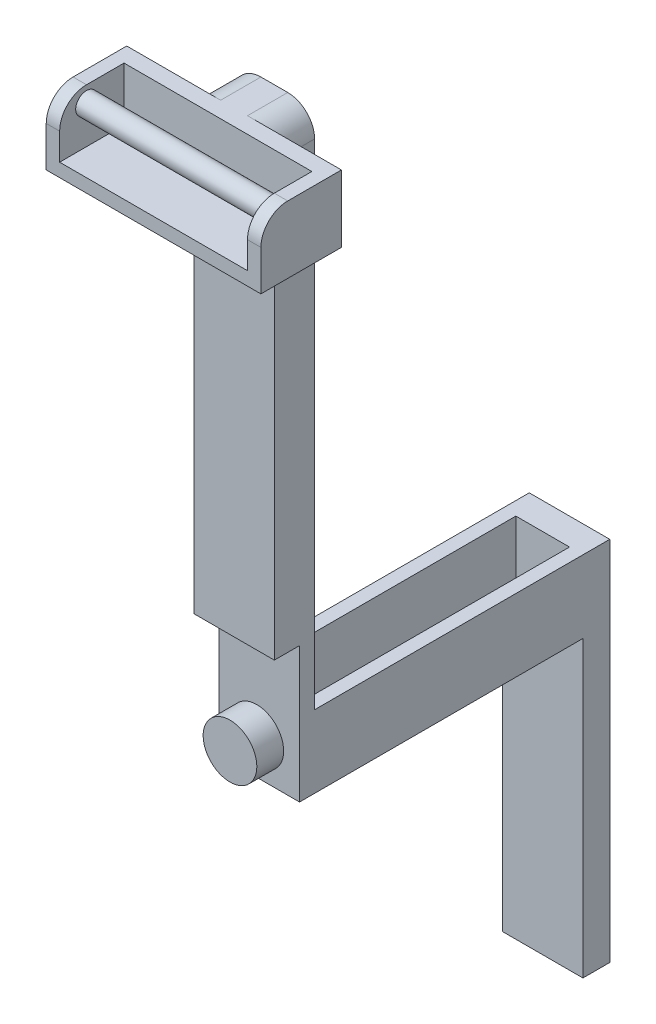
ISO-10303-21;
HEADER;
FILE_DESCRIPTION(('STEP AP214'),'2;1');
FILE_NAME('part.step','',(''),(''),'','','');
FILE_SCHEMA(('AUTOMOTIVE_DESIGN { 1 0 10303 214 1 1 1 1 }'));
ENDSEC;
DATA;
#1=APPLICATION_CONTEXT('core data for automotive mechanical design processes');
#2=APPLICATION_PROTOCOL_DEFINITION('international standard','automotive_design',2000,#1);
#3=PRODUCT_CONTEXT('',#1,'mechanical');
#4=PRODUCT('Part','Part','',(#3));
#5=PRODUCT_RELATED_PRODUCT_CATEGORY('part','',(#4));
#6=PRODUCT_DEFINITION_FORMATION('','',#4);
#7=PRODUCT_DEFINITION_CONTEXT('part definition',#1,'design');
#8=PRODUCT_DEFINITION('design','',#6,#7);
#9=PRODUCT_DEFINITION_SHAPE('','',#8);
#10=(LENGTH_UNIT() NAMED_UNIT(*) SI_UNIT(.MILLI.,.METRE.));
#11=(NAMED_UNIT(*) PLANE_ANGLE_UNIT() SI_UNIT($,.RADIAN.));
#12=(NAMED_UNIT(*) SI_UNIT($,.STERADIAN.) SOLID_ANGLE_UNIT());
#13=UNCERTAINTY_MEASURE_WITH_UNIT(LENGTH_MEASURE(1.E-05),#10,'distance_accuracy_value','');
#14=(GEOMETRIC_REPRESENTATION_CONTEXT(3) GLOBAL_UNCERTAINTY_ASSIGNED_CONTEXT((#13)) GLOBAL_UNIT_ASSIGNED_CONTEXT((#10,
#11,#12)) REPRESENTATION_CONTEXT('',''));
#15=CARTESIAN_POINT('',(0.,0.,0.));
#16=DIRECTION('',(0.,0.,1.));
#17=DIRECTION('',(1.,0.,0.));
#18=AXIS2_PLACEMENT_3D('',#15,#16,#17);
#19=CARTESIAN_POINT('',(-33.5,249.065015771818,5.60294788594664));
#20=DIRECTION('',(0.,0.,-1.));
#21=DIRECTION('',(0.,1.,0.));
#22=AXIS2_PLACEMENT_3D('',#19,#20,#21);
#23=PLANE('',#22);
#24=DIRECTION('',(0.,-1.,0.));
#25=VECTOR('',#24,1.);
#26=CARTESIAN_POINT('',(0.,-197.77568742367,5.6029478859466));
#27=LINE('',#26,#25);
#28=CARTESIAN_POINT('',(0.,249.065015771818,5.60294788594664));
#29=VERTEX_POINT('',#28);
#30=CARTESIAN_POINT('',(0.,198.565015771818,5.60294788594664));
#31=VERTEX_POINT('',#30);
#32=EDGE_CURVE('E224',#29,#31,#27,.T.);
#33=ORIENTED_EDGE('',*,*,#32,.T.);
#34=DIRECTION('',(1.,0.,0.));
#35=VECTOR('',#34,1.);
#36=CARTESIAN_POINT('',(-33.5,198.565015771818,5.60294788594664));
#37=LINE('',#36,#35);
#38=CARTESIAN_POINT('',(30.,198.565015771818,5.60294788594664));
#39=VERTEX_POINT('',#38);
#40=EDGE_CURVE('E400',#31,#39,#37,.T.);
#41=ORIENTED_EDGE('',*,*,#40,.T.);
#42=DIRECTION('',(0.,-1.,0.));
#43=VECTOR('',#42,1.);
#44=CARTESIAN_POINT('',(30.,-197.77568742367,5.6029478859466));
#45=LINE('',#44,#43);
#46=CARTESIAN_POINT('',(30.,249.065015771818,5.60294788594664));
#47=VERTEX_POINT('',#46);
#48=EDGE_CURVE('E39',#47,#39,#45,.T.);
#49=ORIENTED_EDGE('',*,*,#48,.F.);
#50=DIRECTION('',(1.,0.,0.));
#51=VECTOR('',#50,1.);
#52=CARTESIAN_POINT('',(-33.5,249.065015771818,5.60294788594664));
#53=LINE('',#52,#51);
#54=EDGE_CURVE('E216',#29,#47,#53,.T.);
#55=ORIENTED_EDGE('',*,*,#54,.F.);
#56=EDGE_LOOP('',(#33,#41,#49,#55));
#57=FACE_BOUND('',#56,.T.);
#58=CARTESIAN_POINT('',(14.0801246712385,212.060594595528,5.60294788594664));
#59=DIRECTION('',(0.,0.,-1.));
#60=DIRECTION('',(0.,1.,0.));
#61=AXIS2_PLACEMENT_3D('',#58,#59,#60);
#62=CIRCLE('',#61,10.);
#63=CARTESIAN_POINT('',(14.0801246712385,222.060594595528,5.60294788594664));
#64=VERTEX_POINT('',#63);
#65=EDGE_CURVE('E11',#64,#64,#62,.F.);
#66=ORIENTED_EDGE('',*,*,#65,.F.);
#67=EDGE_LOOP('',(#66));
#68=FACE_BOUND('',#67,.T.);
#69=ADVANCED_FACE('F31',(#57,#68),#23,.F.);
#70=CARTESIAN_POINT('',(15.,-197.77568742367,0.));
#71=DIRECTION('',(0.,0.,1.));
#72=DIRECTION('',(1.,0.,0.));
#73=AXIS2_PLACEMENT_3D('',#70,#71,#72);
#74=PLANE('',#73);
#75=DIRECTION('',(1.,0.,0.));
#76=VECTOR('',#75,1.);
#77=CARTESIAN_POINT('',(25.,225.565015771818,0.));
#78=LINE('',#77,#76);
#79=CARTESIAN_POINT('',(25.,225.565015771818,0.));
#80=VERTEX_POINT('',#79);
#81=CARTESIAN_POINT('',(30.,225.565015771818,0.));
#82=VERTEX_POINT('',#81);
#83=EDGE_CURVE('E54',#80,#82,#78,.T.);
#84=ORIENTED_EDGE('',*,*,#83,.F.);
#85=DIRECTION('',(0.,1.,0.));
#86=VECTOR('',#85,1.);
#87=CARTESIAN_POINT('',(25.,203.565015771818,0.));
#88=LINE('',#87,#86);
#89=CARTESIAN_POINT('',(25.,203.565015771818,0.));
#90=VERTEX_POINT('',#89);
#91=EDGE_CURVE('E271',#90,#80,#88,.T.);
#92=ORIENTED_EDGE('',*,*,#91,.F.);
#93=DIRECTION('',(1.,0.,0.));
#94=VECTOR('',#93,1.);
#95=CARTESIAN_POINT('',(5.,203.565015771818,0.));
#96=LINE('',#95,#94);
#97=CARTESIAN_POINT('',(5.,203.565015771818,0.));
#98=VERTEX_POINT('',#97);
#99=EDGE_CURVE('E491',#98,#90,#96,.T.);
#100=ORIENTED_EDGE('',*,*,#99,.F.);
#101=DIRECTION('',(0.,-1.,0.));
#102=VECTOR('',#101,1.);
#103=CARTESIAN_POINT('',(5.,225.565015771818,0.));
#104=LINE('',#103,#102);
#105=CARTESIAN_POINT('',(5.,225.565015771818,0.));
#106=VERTEX_POINT('',#105);
#107=EDGE_CURVE('E257',#106,#98,#104,.T.);
#108=ORIENTED_EDGE('',*,*,#107,.F.);
#109=DIRECTION('',(1.,0.,0.));
#110=VECTOR('',#109,1.);
#111=CARTESIAN_POINT('',(0.,225.565015771818,0.));
#112=LINE('',#111,#110);
#113=CARTESIAN_POINT('',(0.,225.565015771818,0.));
#114=VERTEX_POINT('',#113);
#115=EDGE_CURVE('E254',#114,#106,#112,.T.);
#116=ORIENTED_EDGE('',*,*,#115,.F.);
#117=DIRECTION('',(0.,1.,0.));
#118=VECTOR('',#117,1.);
#119=CARTESIAN_POINT('',(0.,-197.77568742367,0.));
#120=LINE('',#119,#118);
#121=CARTESIAN_POINT('',(0.,409.765015771818,0.));
#122=VERTEX_POINT('',#121);
#123=EDGE_CURVE('E248',#114,#122,#120,.T.);
#124=ORIENTED_EDGE('',*,*,#123,.T.);
#125=CARTESIAN_POINT('',(10.,409.765015771818,0.));
#126=DIRECTION('',(0.,0.,1.));
#127=DIRECTION('',(1.,0.,0.));
#128=AXIS2_PLACEMENT_3D('',#125,#126,#127);
#129=CIRCLE('',#128,10.);
#130=CARTESIAN_POINT('',(10.,419.765015771818,0.));
#131=VERTEX_POINT('',#130);
#132=EDGE_CURVE('E374',#122,#131,#129,.F.);
#133=ORIENTED_EDGE('',*,*,#132,.T.);
#134=DIRECTION('',(-1.,0.,0.));
#135=VECTOR('',#134,1.);
#136=CARTESIAN_POINT('',(15.,419.765015771818,0.));
#137=LINE('',#136,#135);
#138=CARTESIAN_POINT('',(20.,419.765015771818,0.));
#139=VERTEX_POINT('',#138);
#140=EDGE_CURVE('E236',#139,#131,#137,.T.);
#141=ORIENTED_EDGE('',*,*,#140,.F.);
#142=CARTESIAN_POINT('',(20.,409.765015771818,0.));
#143=DIRECTION('',(0.,0.,1.));
#144=DIRECTION('',(1.,0.,0.));
#145=AXIS2_PLACEMENT_3D('',#142,#143,#144);
#146=CIRCLE('',#145,10.);
#147=CARTESIAN_POINT('',(30.,409.765015771818,0.));
#148=VERTEX_POINT('',#147);
#149=EDGE_CURVE('E242',#139,#148,#146,.F.);
#150=ORIENTED_EDGE('',*,*,#149,.T.);
#151=DIRECTION('',(0.,1.,0.));
#152=VECTOR('',#151,1.);
#153=CARTESIAN_POINT('',(30.,-197.77568742367,0.));
#154=LINE('',#153,#152);
#155=EDGE_CURVE('E251',#82,#148,#154,.T.);
#156=ORIENTED_EDGE('',*,*,#155,.F.);
#157=EDGE_LOOP('',(#84,#92,#100,#108,#116,#124,#133,#141,#150,#156));
#158=FACE_BOUND('',#157,.T.);
#159=ADVANCED_FACE('F388',(#158),#74,.F.);
#160=CARTESIAN_POINT('',(-19.9999999999998,419.765015771818,21.));
#161=DIRECTION('',(-1.,0.,0.));
#162=DIRECTION('',(0.,0.,1.));
#163=AXIS2_PLACEMENT_3D('',#160,#161,#162);
#164=PLANE('',#163);
#165=DIRECTION('',(0.,0.,1.));
#166=VECTOR('',#165,1.);
#167=CARTESIAN_POINT('',(-19.9999999999998,419.765015771818,21.));
#168=LINE('',#167,#166);
#169=CARTESIAN_POINT('',(-19.9999999999998,419.765015771818,21.));
#170=VERTEX_POINT('',#169);
#171=CARTESIAN_POINT('',(-19.9999999999998,419.765015771818,35.));
#172=VERTEX_POINT('',#171);
#173=EDGE_CURVE('E307',#170,#172,#168,.T.);
#174=ORIENTED_EDGE('',*,*,#173,.T.);
#175=CARTESIAN_POINT('',(-19.9999999999998,409.765015771818,35.));
#176=DIRECTION('',(-1.,0.,0.));
#177=DIRECTION('',(0.,0.,1.));
#178=AXIS2_PLACEMENT_3D('',#175,#176,#177);
#179=CIRCLE('',#178,10.);
#180=CARTESIAN_POINT('',(-19.9999999999998,409.765015771818,45.));
#181=VERTEX_POINT('',#180);
#182=EDGE_CURVE('E537',#172,#181,#179,.F.);
#183=ORIENTED_EDGE('',*,*,#182,.T.);
#184=DIRECTION('',(0.,-1.,0.));
#185=VECTOR('',#184,1.);
#186=CARTESIAN_POINT('',(-19.9999999999998,419.765015771818,45.));
#187=LINE('',#186,#185);
#188=CARTESIAN_POINT('',(-19.9999999999998,399.765015771818,45.));
#189=VERTEX_POINT('',#188);
#190=EDGE_CURVE('E299',#181,#189,#187,.T.);
#191=ORIENTED_EDGE('',*,*,#190,.T.);
#192=DIRECTION('',(0.,0.,1.));
#193=VECTOR('',#192,1.);
#194=CARTESIAN_POINT('',(-19.9999999999998,399.765015771818,21.));
#195=LINE('',#194,#193);
#196=CARTESIAN_POINT('',(-19.9999999999998,399.765015771818,21.));
#197=VERTEX_POINT('',#196);
#198=EDGE_CURVE('E298',#197,#189,#195,.T.);
#199=ORIENTED_EDGE('',*,*,#198,.F.);
#200=DIRECTION('',(0.,-1.,0.));
#201=VECTOR('',#200,1.);
#202=CARTESIAN_POINT('',(-19.9999999999998,419.765015771818,21.));
#203=LINE('',#202,#201);
#204=EDGE_CURVE('E285',#170,#197,#203,.T.);
#205=ORIENTED_EDGE('',*,*,#204,.F.);
#206=EDGE_LOOP('',(#174,#183,#191,#199,#205));
#207=FACE_BOUND('',#206,.T.);
#208=CARTESIAN_POINT('',(-19.9999999999818,413.847695374528,35.));
#209=DIRECTION('',(-1.,0.,0.));
#210=DIRECTION('',(0.,0.,1.));
#211=AXIS2_PLACEMENT_3D('',#208,#209,#210);
#212=CIRCLE('',#211,4.02917800820291);
#213=CARTESIAN_POINT('',(-19.9999999999818,413.847695374528,30.9708219917971));
#214=VERTEX_POINT('',#213);
#215=EDGE_CURVE('E550',#214,#214,#212,.F.);
#216=ORIENTED_EDGE('',*,*,#215,.F.);
#217=EDGE_LOOP('',(#216));
#218=FACE_BOUND('',#217,.T.);
#219=ADVANCED_FACE('F556',(#207,#218),#164,.F.);
#220=CARTESIAN_POINT('',(50.0000000000002,419.765015771818,21.));
#221=DIRECTION('',(1.,0.,0.));
#222=DIRECTION('',(0.,0.,-1.));
#223=AXIS2_PLACEMENT_3D('',#220,#221,#222);
#224=PLANE('',#223);
#225=DIRECTION('',(0.,1.,0.));
#226=VECTOR('',#225,1.);
#227=CARTESIAN_POINT('',(50.0000000000002,419.765015771818,45.));
#228=LINE('',#227,#226);
#229=CARTESIAN_POINT('',(50.0000000000002,399.765015771818,45.));
#230=VERTEX_POINT('',#229);
#231=CARTESIAN_POINT('',(50.0000000000002,409.765015771818,45.));
#232=VERTEX_POINT('',#231);
#233=EDGE_CURVE('E289',#230,#232,#228,.T.);
#234=ORIENTED_EDGE('',*,*,#233,.T.);
#235=CARTESIAN_POINT('',(50.0000000000002,409.765015771818,35.));
#236=DIRECTION('',(1.,0.,0.));
#237=DIRECTION('',(0.,0.,-1.));
#238=AXIS2_PLACEMENT_3D('',#235,#236,#237);
#239=CIRCLE('',#238,10.);
#240=CARTESIAN_POINT('',(50.0000000000002,419.765015771818,35.));
#241=VERTEX_POINT('',#240);
#242=EDGE_CURVE('E540',#232,#241,#239,.F.);
#243=ORIENTED_EDGE('',*,*,#242,.T.);
#244=DIRECTION('',(0.,0.,1.));
#245=VECTOR('',#244,1.);
#246=CARTESIAN_POINT('',(50.0000000000002,419.765015771818,21.));
#247=LINE('',#246,#245);
#248=CARTESIAN_POINT('',(50.0000000000002,419.765015771818,21.));
#249=VERTEX_POINT('',#248);
#250=EDGE_CURVE('E311',#249,#241,#247,.T.);
#251=ORIENTED_EDGE('',*,*,#250,.F.);
#252=DIRECTION('',(0.,1.,0.));
#253=VECTOR('',#252,1.);
#254=CARTESIAN_POINT('',(50.0000000000002,419.765015771818,21.));
#255=LINE('',#254,#253);
#256=CARTESIAN_POINT('',(50.0000000000002,399.765015771818,21.));
#257=VERTEX_POINT('',#256);
#258=EDGE_CURVE('E292',#257,#249,#255,.T.);
#259=ORIENTED_EDGE('',*,*,#258,.F.);
#260=DIRECTION('',(0.,0.,1.));
#261=VECTOR('',#260,1.);
#262=CARTESIAN_POINT('',(50.0000000000002,399.765015771818,21.));
#263=LINE('',#262,#261);
#264=EDGE_CURVE('E314',#257,#230,#263,.T.);
#265=ORIENTED_EDGE('',*,*,#264,.T.);
#266=EDGE_LOOP('',(#234,#243,#251,#259,#265));
#267=FACE_BOUND('',#266,.T.);
#268=CARTESIAN_POINT('',(50.0000000000114,413.847695374528,35.));
#269=DIRECTION('',(1.,0.,0.));
#270=DIRECTION('',(0.,0.,-1.));
#271=AXIS2_PLACEMENT_3D('',#268,#269,#270);
#272=CIRCLE('',#271,4.02917800820291);
#273=CARTESIAN_POINT('',(49.9999999999545,413.847695374528,30.9708219917971));
#274=VERTEX_POINT('',#273);
#275=EDGE_CURVE('E548',#274,#274,#272,.F.);
#276=ORIENTED_EDGE('',*,*,#275,.F.);
#277=EDGE_LOOP('',(#276));
#278=FACE_BOUND('',#277,.T.);
#279=ADVANCED_FACE('F558',(#267,#278),#224,.F.);
#280=CARTESIAN_POINT('',(15.,198.565015771818,15.));
#281=DIRECTION('',(0.,-1.,0.));
#282=DIRECTION('',(0.,0.,-1.));
#283=AXIS2_PLACEMENT_3D('',#280,#281,#282);
#284=PLANE('',#283);
#285=ORIENTED_EDGE('',*,*,#40,.F.);
#286=DIRECTION('',(0.,0.,-1.));
#287=VECTOR('',#286,1.);
#288=CARTESIAN_POINT('',(0.,198.565015771818,45.));
#289=LINE('',#288,#287);
#290=CARTESIAN_POINT('',(0.,198.565015771818,-100.));
#291=VERTEX_POINT('',#290);
#292=EDGE_CURVE('E264',#31,#291,#289,.T.);
#293=ORIENTED_EDGE('',*,*,#292,.T.);
#294=DIRECTION('',(-1.,0.,0.));
#295=VECTOR('',#294,1.);
#296=CARTESIAN_POINT('',(30.,198.565015771818,-100.));
#297=LINE('',#296,#295);
#298=CARTESIAN_POINT('',(30.,198.565015771818,-100.));
#299=VERTEX_POINT('',#298);
#300=EDGE_CURVE('E270',#299,#291,#297,.T.);
#301=ORIENTED_EDGE('',*,*,#300,.F.);
#302=DIRECTION('',(0.,0.,-1.));
#303=VECTOR('',#302,1.);
#304=CARTESIAN_POINT('',(30.,198.565015771818,45.));
#305=LINE('',#304,#303);
#306=EDGE_CURVE('E302',#39,#299,#305,.T.);
#307=ORIENTED_EDGE('',*,*,#306,.F.);
#308=EDGE_LOOP('',(#285,#293,#301,#307));
#309=FACE_BOUND('',#308,.T.);
#310=ADVANCED_FACE('F564',(#309),#284,.T.);
#311=CARTESIAN_POINT('',(0.,-197.77568742367,15.));
#312=DIRECTION('',(-1.,0.,0.));
#313=DIRECTION('',(0.,0.,1.));
#314=AXIS2_PLACEMENT_3D('',#311,#312,#313);
#315=PLANE('',#314);
#316=DIRECTION('',(0.,0.,-1.));
#317=VECTOR('',#316,1.);
#318=CARTESIAN_POINT('',(0.,249.065015771818,15.));
#319=LINE('',#318,#317);
#320=CARTESIAN_POINT('',(0.,249.065015771818,15.));
#321=VERTEX_POINT('',#320);
#322=EDGE_CURVE('E211',#321,#29,#319,.T.);
#323=ORIENTED_EDGE('',*,*,#322,.F.);
#324=DIRECTION('',(0.,1.,0.));
#325=VECTOR('',#324,1.);
#326=CARTESIAN_POINT('',(0.,-197.77568742367,15.));
#327=LINE('',#326,#325);
#328=CARTESIAN_POINT('',(0.,394.765015771818,15.));
#329=VERTEX_POINT('',#328);
#330=EDGE_CURVE('E221',#321,#329,#327,.T.);
#331=ORIENTED_EDGE('',*,*,#330,.T.);
#332=CARTESIAN_POINT('',(0.,409.765015771818,15.));
#333=VERTEX_POINT('',#332);
#334=EDGE_CURVE('E231',#329,#333,#327,.T.);
#335=ORIENTED_EDGE('',*,*,#334,.T.);
#336=DIRECTION('',(0.,0.,-1.));
#337=VECTOR('',#336,1.);
#338=CARTESIAN_POINT('',(0.,409.765015771818,0.));
#339=LINE('',#338,#337);
#340=EDGE_CURVE('E361',#333,#122,#339,.T.);
#341=ORIENTED_EDGE('',*,*,#340,.T.);
#342=ORIENTED_EDGE('',*,*,#123,.F.);
#343=DIRECTION('',(0.,0.,1.));
#344=VECTOR('',#343,1.);
#345=CARTESIAN_POINT('',(0.,225.565015771818,-100.));
#346=LINE('',#345,#344);
#347=CARTESIAN_POINT('',(0.,225.565015771818,-110.));
#348=VERTEX_POINT('',#347);
#349=EDGE_CURVE('E261',#348,#114,#346,.T.);
#350=ORIENTED_EDGE('',*,*,#349,.F.);
#351=DIRECTION('',(0.,1.,0.));
#352=VECTOR('',#351,1.);
#353=CARTESIAN_POINT('',(0.,225.565015771818,-110.));
#354=LINE('',#353,#352);
#355=CARTESIAN_POINT('',(0.,88.9838340423188,-110.));
#356=VERTEX_POINT('',#355);
#357=EDGE_CURVE('E411',#356,#348,#354,.T.);
#358=ORIENTED_EDGE('',*,*,#357,.F.);
#359=DIRECTION('',(0.,0.,1.));
#360=VECTOR('',#359,1.);
#361=CARTESIAN_POINT('',(0.,88.9838340423188,-110.));
#362=LINE('',#361,#360);
#363=CARTESIAN_POINT('',(0.,88.9838340423188,-100.));
#364=VERTEX_POINT('',#363);
#365=EDGE_CURVE('E417',#356,#364,#362,.T.);
#366=ORIENTED_EDGE('',*,*,#365,.T.);
#367=DIRECTION('',(0.,1.,0.));
#368=VECTOR('',#367,1.);
#369=CARTESIAN_POINT('',(0.,225.565015771818,-100.));
#370=LINE('',#369,#368);
#371=EDGE_CURVE('E429',#364,#291,#370,.T.);
#372=ORIENTED_EDGE('',*,*,#371,.T.);
#373=ORIENTED_EDGE('',*,*,#292,.F.);
#374=ORIENTED_EDGE('',*,*,#32,.F.);
#375=EDGE_LOOP('',(#323,#331,#335,#341,#342,#350,#358,#366,#372,#373,#374));
#376=FACE_BOUND('',#375,.T.);
#377=ADVANCED_FACE('F220',(#376),#315,.T.);
#378=CARTESIAN_POINT('',(30.,-197.77568742367,15.));
#379=DIRECTION('',(-1.,0.,0.));
#380=DIRECTION('',(0.,0.,1.));
#381=AXIS2_PLACEMENT_3D('',#378,#379,#380);
#382=PLANE('',#381);
#383=DIRECTION('',(0.,1.,0.));
#384=VECTOR('',#383,1.);
#385=CARTESIAN_POINT('',(30.,-197.77568742367,15.));
#386=LINE('',#385,#384);
#387=CARTESIAN_POINT('',(30.,249.065015771818,15.));
#388=VERTEX_POINT('',#387);
#389=CARTESIAN_POINT('',(30.,394.765015771818,15.));
#390=VERTEX_POINT('',#389);
#391=EDGE_CURVE('E234',#388,#390,#386,.T.);
#392=ORIENTED_EDGE('',*,*,#391,.F.);
#393=DIRECTION('',(0.,0.,-1.));
#394=VECTOR('',#393,1.);
#395=CARTESIAN_POINT('',(30.,249.065015771818,15.));
#396=LINE('',#395,#394);
#397=EDGE_CURVE('E46',#388,#47,#396,.T.);
#398=ORIENTED_EDGE('',*,*,#397,.T.);
#399=ORIENTED_EDGE('',*,*,#48,.T.);
#400=ORIENTED_EDGE('',*,*,#306,.T.);
#401=DIRECTION('',(0.,-1.,0.));
#402=VECTOR('',#401,1.);
#403=CARTESIAN_POINT('',(30.,225.565015771818,-100.));
#404=LINE('',#403,#402);
#405=CARTESIAN_POINT('',(30.,88.9838340423188,-100.));
#406=VERTEX_POINT('',#405);
#407=EDGE_CURVE('E404',#299,#406,#404,.T.);
#408=ORIENTED_EDGE('',*,*,#407,.T.);
#409=DIRECTION('',(0.,0.,1.));
#410=VECTOR('',#409,1.);
#411=CARTESIAN_POINT('',(30.,88.9838340423188,-110.));
#412=LINE('',#411,#410);
#413=CARTESIAN_POINT('',(30.,88.9838340423188,-110.));
#414=VERTEX_POINT('',#413);
#415=EDGE_CURVE('E258',#414,#406,#412,.T.);
#416=ORIENTED_EDGE('',*,*,#415,.F.);
#417=DIRECTION('',(0.,-1.,0.));
#418=VECTOR('',#417,1.);
#419=CARTESIAN_POINT('',(30.,225.565015771818,-110.));
#420=LINE('',#419,#418);
#421=CARTESIAN_POINT('',(30.,225.565015771818,-110.));
#422=VERTEX_POINT('',#421);
#423=EDGE_CURVE('E405',#422,#414,#420,.T.);
#424=ORIENTED_EDGE('',*,*,#423,.F.);
#425=DIRECTION('',(0.,0.,1.));
#426=VECTOR('',#425,1.);
#427=CARTESIAN_POINT('',(30.,225.565015771818,-100.));
#428=LINE('',#427,#426);
#429=EDGE_CURVE('E272',#422,#82,#428,.T.);
#430=ORIENTED_EDGE('',*,*,#429,.T.);
#431=ORIENTED_EDGE('',*,*,#155,.T.);
#432=DIRECTION('',(0.,0.,-1.));
#433=VECTOR('',#432,1.);
#434=CARTESIAN_POINT('',(30.,409.765015771818,15.));
#435=LINE('',#434,#433);
#436=CARTESIAN_POINT('',(30.,409.765015771818,15.));
#437=VERTEX_POINT('',#436);
#438=EDGE_CURVE('E348',#148,#437,#435,.F.);
#439=ORIENTED_EDGE('',*,*,#438,.T.);
#440=EDGE_CURVE('E230',#390,#437,#386,.T.);
#441=ORIENTED_EDGE('',*,*,#440,.F.);
#442=EDGE_LOOP('',(#392,#398,#399,#400,#408,#416,#424,#430,#431,#439,#441));
#443=FACE_BOUND('',#442,.T.);
#444=ADVANCED_FACE('F386',(#443),#382,.F.);
#445=CARTESIAN_POINT('',(15.,419.765015771818,15.));
#446=DIRECTION('',(0.,-1.,0.));
#447=DIRECTION('',(0.,0.,-1.));
#448=AXIS2_PLACEMENT_3D('',#445,#446,#447);
#449=PLANE('',#448);
#450=DIRECTION('',(0.,0.,-1.));
#451=VECTOR('',#450,1.);
#452=CARTESIAN_POINT('',(-24.9999999999998,419.765015771818,45.));
#453=LINE('',#452,#451);
#454=CARTESIAN_POINT('',(-24.9999999999998,419.765015771818,35.));
#455=VERTEX_POINT('',#454);
#456=CARTESIAN_POINT('',(-24.9999999999998,419.765015771818,15.));
#457=VERTEX_POINT('',#456);
#458=EDGE_CURVE('E337',#455,#457,#453,.T.);
#459=ORIENTED_EDGE('',*,*,#458,.F.);
#460=DIRECTION('',(-1.,0.,0.));
#461=VECTOR('',#460,1.);
#462=CARTESIAN_POINT('',(15.,419.765015771818,35.));
#463=LINE('',#462,#461);
#464=EDGE_CURVE('E532',#455,#172,#463,.F.);
#465=ORIENTED_EDGE('',*,*,#464,.T.);
#466=ORIENTED_EDGE('',*,*,#173,.F.);
#467=DIRECTION('',(-1.,0.,0.));
#468=VECTOR('',#467,1.);
#469=CARTESIAN_POINT('',(-19.9999999999998,419.765015771818,21.));
#470=LINE('',#469,#468);
#471=EDGE_CURVE('E295',#249,#170,#470,.T.);
#472=ORIENTED_EDGE('',*,*,#471,.F.);
#473=ORIENTED_EDGE('',*,*,#250,.T.);
#474=DIRECTION('',(-1.,0.,0.));
#475=VECTOR('',#474,1.);
#476=CARTESIAN_POINT('',(15.,419.765015771818,35.));
#477=LINE('',#476,#475);
#478=CARTESIAN_POINT('',(55.0000000000002,419.765015771818,35.));
#479=VERTEX_POINT('',#478);
#480=EDGE_CURVE('E538',#241,#479,#477,.F.);
#481=ORIENTED_EDGE('',*,*,#480,.T.);
#482=DIRECTION('',(0.,0.,-1.));
#483=VECTOR('',#482,1.);
#484=CARTESIAN_POINT('',(55.0000000000002,419.765015771818,45.));
#485=LINE('',#484,#483);
#486=CARTESIAN_POINT('',(55.0000000000002,419.765015771818,15.));
#487=VERTEX_POINT('',#486);
#488=EDGE_CURVE('E252',#479,#487,#485,.T.);
#489=ORIENTED_EDGE('',*,*,#488,.T.);
#490=DIRECTION('',(-1.,0.,0.));
#491=VECTOR('',#490,1.);
#492=CARTESIAN_POINT('',(-24.9999999999998,419.765015771818,15.));
#493=LINE('',#492,#491);
#494=CARTESIAN_POINT('',(20.,419.765015771818,15.));
#495=VERTEX_POINT('',#494);
#496=EDGE_CURVE('E333',#487,#495,#493,.T.);
#497=ORIENTED_EDGE('',*,*,#496,.T.);
#498=DIRECTION('',(0.,0.,-1.));
#499=VECTOR('',#498,1.);
#500=CARTESIAN_POINT('',(20.,419.765015771818,15.));
#501=LINE('',#500,#499);
#502=EDGE_CURVE('E358',#495,#139,#501,.T.);
#503=ORIENTED_EDGE('',*,*,#502,.T.);
#504=ORIENTED_EDGE('',*,*,#140,.T.);
#505=DIRECTION('',(0.,0.,-1.));
#506=VECTOR('',#505,1.);
#507=CARTESIAN_POINT('',(10.,419.765015771818,15.));
#508=LINE('',#507,#506);
#509=CARTESIAN_POINT('',(10.,419.765015771818,15.));
#510=VERTEX_POINT('',#509);
#511=EDGE_CURVE('E352',#131,#510,#508,.F.);
#512=ORIENTED_EDGE('',*,*,#511,.T.);
#513=EDGE_CURVE('E238',#510,#457,#493,.T.);
#514=ORIENTED_EDGE('',*,*,#513,.T.);
#515=EDGE_LOOP('',(#459,#465,#466,#472,#473,#481,#489,#497,#503,#504,#512,#514));
#516=FACE_BOUND('',#515,.T.);
#517=ADVANCED_FACE('F505',(#516),#449,.F.);
#518=CARTESIAN_POINT('',(15.,-197.77568742367,15.));
#519=DIRECTION('',(0.,0.,1.));
#520=DIRECTION('',(1.,0.,0.));
#521=AXIS2_PLACEMENT_3D('',#518,#519,#520);
#522=PLANE('',#521);
#523=DIRECTION('',(1.,0.,0.));
#524=VECTOR('',#523,1.);
#525=CARTESIAN_POINT('',(-33.5,249.065015771818,15.));
#526=LINE('',#525,#524);
#527=EDGE_CURVE('E208',#321,#388,#526,.T.);
#528=ORIENTED_EDGE('',*,*,#527,.T.);
#529=ORIENTED_EDGE('',*,*,#391,.T.);
#530=DIRECTION('',(1.,0.,0.));
#531=VECTOR('',#530,1.);
#532=CARTESIAN_POINT('',(-24.9999999999998,394.765015771818,15.));
#533=LINE('',#532,#531);
#534=EDGE_CURVE('E228',#329,#390,#533,.T.);
#535=ORIENTED_EDGE('',*,*,#534,.F.);
#536=ORIENTED_EDGE('',*,*,#330,.F.);
#537=EDGE_LOOP('',(#528,#529,#535,#536));
#538=FACE_BOUND('',#537,.T.);
#539=ADVANCED_FACE('F226',(#538),#522,.T.);
#540=CARTESIAN_POINT('',(10.,409.765015771818,15.));
#541=DIRECTION('',(0.,0.,1.));
#542=DIRECTION('',(1.,0.,0.));
#543=AXIS2_PLACEMENT_3D('',#540,#541,#542);
#544=CYLINDRICAL_SURFACE('',#543,10.);
#545=CARTESIAN_POINT('',(10.,409.765015771818,15.));
#546=DIRECTION('',(0.,0.,1.));
#547=DIRECTION('',(1.,0.,0.));
#548=AXIS2_PLACEMENT_3D('',#545,#546,#547);
#549=CIRCLE('',#548,10.);
#550=EDGE_CURVE('E366',#510,#333,#549,.T.);
#551=ORIENTED_EDGE('',*,*,#550,.F.);
#552=ORIENTED_EDGE('',*,*,#511,.F.);
#553=ORIENTED_EDGE('',*,*,#132,.F.);
#554=ORIENTED_EDGE('',*,*,#340,.F.);
#555=EDGE_LOOP('',(#551,#552,#553,#554));
#556=FACE_BOUND('',#555,.T.);
#557=ADVANCED_FACE('F529',(#556),#544,.T.);
#558=CARTESIAN_POINT('',(20.,409.765015771818,15.));
#559=DIRECTION('',(0.,0.,-1.));
#560=DIRECTION('',(-1.,0.,0.));
#561=AXIS2_PLACEMENT_3D('',#558,#559,#560);
#562=CYLINDRICAL_SURFACE('',#561,10.);
#563=CARTESIAN_POINT('',(20.,409.765015771818,15.));
#564=DIRECTION('',(0.,0.,1.));
#565=DIRECTION('',(1.,0.,0.));
#566=AXIS2_PLACEMENT_3D('',#563,#564,#565);
#567=CIRCLE('',#566,10.);
#568=EDGE_CURVE('E369',#437,#495,#567,.T.);
#569=ORIENTED_EDGE('',*,*,#568,.F.);
#570=ORIENTED_EDGE('',*,*,#438,.F.);
#571=ORIENTED_EDGE('',*,*,#149,.F.);
#572=ORIENTED_EDGE('',*,*,#502,.F.);
#573=EDGE_LOOP('',(#569,#570,#571,#572));
#574=FACE_BOUND('',#573,.T.);
#575=ADVANCED_FACE('F390',(#574),#562,.T.);
#576=CARTESIAN_POINT('',(55.0000000000002,419.765015771818,15.));
#577=DIRECTION('',(0.,0.,-1.));
#578=DIRECTION('',(-1.,0.,0.));
#579=AXIS2_PLACEMENT_3D('',#576,#577,#578);
#580=PLANE('',#579);
#581=CARTESIAN_POINT('',(55.0000000000002,394.765015771818,15.));
#582=VERTEX_POINT('',#581);
#583=EDGE_CURVE('E344',#390,#582,#533,.T.);
#584=ORIENTED_EDGE('',*,*,#583,.F.);
#585=ORIENTED_EDGE('',*,*,#440,.T.);
#586=ORIENTED_EDGE('',*,*,#568,.T.);
#587=ORIENTED_EDGE('',*,*,#496,.F.);
#588=DIRECTION('',(0.,1.,0.));
#589=VECTOR('',#588,1.);
#590=CARTESIAN_POINT('',(55.0000000000002,394.765015771818,15.));
#591=LINE('',#590,#589);
#592=EDGE_CURVE('E310',#582,#487,#591,.T.);
#593=ORIENTED_EDGE('',*,*,#592,.F.);
#594=EDGE_LOOP('',(#584,#585,#586,#587,#593));
#595=FACE_BOUND('',#594,.T.);
#596=ADVANCED_FACE('F394',(#595),#580,.T.);
#597=CARTESIAN_POINT('',(55.0000000000002,394.765015771818,45.));
#598=DIRECTION('',(-1.,0.,0.));
#599=DIRECTION('',(0.,0.,1.));
#600=AXIS2_PLACEMENT_3D('',#597,#598,#599);
#601=PLANE('',#600);
#602=ORIENTED_EDGE('',*,*,#488,.F.);
#603=CARTESIAN_POINT('',(55.0000000000002,409.765015771818,35.));
#604=DIRECTION('',(-1.,0.,0.));
#605=DIRECTION('',(0.,0.,1.));
#606=AXIS2_PLACEMENT_3D('',#603,#604,#605);
#607=CIRCLE('',#606,10.);
#608=CARTESIAN_POINT('',(55.0000000000002,409.765015771818,45.));
#609=VERTEX_POINT('',#608);
#610=EDGE_CURVE('E546',#479,#609,#607,.F.);
#611=ORIENTED_EDGE('',*,*,#610,.T.);
#612=DIRECTION('',(0.,1.,0.));
#613=VECTOR('',#612,1.);
#614=CARTESIAN_POINT('',(55.0000000000002,394.765015771818,45.));
#615=LINE('',#614,#613);
#616=CARTESIAN_POINT('',(55.0000000000002,394.765015771818,45.));
#617=VERTEX_POINT('',#616);
#618=EDGE_CURVE('E318',#617,#609,#615,.T.);
#619=ORIENTED_EDGE('',*,*,#618,.F.);
#620=DIRECTION('',(0.,0.,-1.));
#621=VECTOR('',#620,1.);
#622=CARTESIAN_POINT('',(55.0000000000002,394.765015771818,45.));
#623=LINE('',#622,#621);
#624=EDGE_CURVE('E326',#617,#582,#623,.T.);
#625=ORIENTED_EDGE('',*,*,#624,.T.);
#626=ORIENTED_EDGE('',*,*,#592,.T.);
#627=EDGE_LOOP('',(#602,#611,#619,#625,#626));
#628=FACE_BOUND('',#627,.T.);
#629=ADVANCED_FACE('F508',(#628),#601,.F.);
#630=CARTESIAN_POINT('',(-24.9999999999998,394.765015771818,45.));
#631=DIRECTION('',(1.,0.,0.));
#632=DIRECTION('',(0.,0.,-1.));
#633=AXIS2_PLACEMENT_3D('',#630,#631,#632);
#634=PLANE('',#633);
#635=DIRECTION('',(0.,-1.,0.));
#636=VECTOR('',#635,1.);
#637=CARTESIAN_POINT('',(-24.9999999999998,394.765015771818,45.));
#638=LINE('',#637,#636);
#639=CARTESIAN_POINT('',(-24.9999999999998,409.765015771818,45.));
#640=VERTEX_POINT('',#639);
#641=CARTESIAN_POINT('',(-24.9999999999998,394.765015771818,45.));
#642=VERTEX_POINT('',#641);
#643=EDGE_CURVE('E321',#640,#642,#638,.T.);
#644=ORIENTED_EDGE('',*,*,#643,.F.);
#645=CARTESIAN_POINT('',(-24.9999999999998,409.765015771818,35.));
#646=DIRECTION('',(1.,0.,0.));
#647=DIRECTION('',(0.,0.,-1.));
#648=AXIS2_PLACEMENT_3D('',#645,#646,#647);
#649=CIRCLE('',#648,10.);
#650=EDGE_CURVE('E536',#640,#455,#649,.F.);
#651=ORIENTED_EDGE('',*,*,#650,.T.);
#652=ORIENTED_EDGE('',*,*,#458,.T.);
#653=DIRECTION('',(0.,-1.,0.));
#654=VECTOR('',#653,1.);
#655=CARTESIAN_POINT('',(-24.9999999999998,394.765015771818,15.));
#656=LINE('',#655,#654);
#657=CARTESIAN_POINT('',(-24.9999999999998,394.765015771818,15.));
#658=VERTEX_POINT('',#657);
#659=EDGE_CURVE('E330',#457,#658,#656,.T.);
#660=ORIENTED_EDGE('',*,*,#659,.T.);
#661=DIRECTION('',(0.,0.,-1.));
#662=VECTOR('',#661,1.);
#663=CARTESIAN_POINT('',(-24.9999999999998,394.765015771818,45.));
#664=LINE('',#663,#662);
#665=EDGE_CURVE('E339',#642,#658,#664,.T.);
#666=ORIENTED_EDGE('',*,*,#665,.F.);
#667=EDGE_LOOP('',(#644,#651,#652,#660,#666));
#668=FACE_BOUND('',#667,.T.);
#669=ADVANCED_FACE('F523',(#668),#634,.F.);
#670=CARTESIAN_POINT('',(-24.9999999999998,394.765015771818,45.));
#671=DIRECTION('',(0.,1.,0.));
#672=DIRECTION('',(0.,0.,1.));
#673=AXIS2_PLACEMENT_3D('',#670,#671,#672);
#674=PLANE('',#673);
#675=EDGE_CURVE('E322',#658,#329,#533,.T.);
#676=ORIENTED_EDGE('',*,*,#675,.T.);
#677=ORIENTED_EDGE('',*,*,#534,.T.);
#678=ORIENTED_EDGE('',*,*,#583,.T.);
#679=ORIENTED_EDGE('',*,*,#624,.F.);
#680=DIRECTION('',(1.,0.,0.));
#681=VECTOR('',#680,1.);
#682=CARTESIAN_POINT('',(-24.9999999999998,394.765015771818,45.));
#683=LINE('',#682,#681);
#684=EDGE_CURVE('E324',#642,#617,#683,.T.);
#685=ORIENTED_EDGE('',*,*,#684,.F.);
#686=ORIENTED_EDGE('',*,*,#665,.T.);
#687=EDGE_LOOP('',(#676,#677,#678,#679,#685,#686));
#688=FACE_BOUND('',#687,.T.);
#689=ADVANCED_FACE('F513',(#688),#674,.F.);
#690=CARTESIAN_POINT('',(55.0000000000002,419.765015771818,45.));
#691=DIRECTION('',(0.,0.,-1.));
#692=DIRECTION('',(-1.,0.,0.));
#693=AXIS2_PLACEMENT_3D('',#690,#691,#692);
#694=PLANE('',#693);
#695=ORIENTED_EDGE('',*,*,#190,.F.);
#696=DIRECTION('',(-1.,0.,0.));
#697=VECTOR('',#696,1.);
#698=CARTESIAN_POINT('',(55.0000000000002,409.765015771818,45.));
#699=LINE('',#698,#697);
#700=EDGE_CURVE('E350',#181,#640,#699,.T.);
#701=ORIENTED_EDGE('',*,*,#700,.T.);
#702=ORIENTED_EDGE('',*,*,#643,.T.);
#703=ORIENTED_EDGE('',*,*,#684,.T.);
#704=ORIENTED_EDGE('',*,*,#618,.T.);
#705=DIRECTION('',(-1.,0.,0.));
#706=VECTOR('',#705,1.);
#707=CARTESIAN_POINT('',(55.0000000000002,409.765015771818,45.));
#708=LINE('',#707,#706);
#709=EDGE_CURVE('E347',#609,#232,#708,.T.);
#710=ORIENTED_EDGE('',*,*,#709,.T.);
#711=ORIENTED_EDGE('',*,*,#233,.F.);
#712=DIRECTION('',(1.,0.,0.));
#713=VECTOR('',#712,1.);
#714=CARTESIAN_POINT('',(-19.9999999999998,399.765015771818,45.));
#715=LINE('',#714,#713);
#716=EDGE_CURVE('E301',#189,#230,#715,.T.);
#717=ORIENTED_EDGE('',*,*,#716,.F.);
#718=EDGE_LOOP('',(#695,#701,#702,#703,#704,#710,#711,#717));
#719=FACE_BOUND('',#718,.T.);
#720=ADVANCED_FACE('F517',(#719),#694,.F.);
#721=ORIENTED_EDGE('',*,*,#513,.F.);
#722=ORIENTED_EDGE('',*,*,#550,.T.);
#723=ORIENTED_EDGE('',*,*,#334,.F.);
#724=ORIENTED_EDGE('',*,*,#675,.F.);
#725=ORIENTED_EDGE('',*,*,#659,.F.);
#726=EDGE_LOOP('',(#721,#722,#723,#724,#725));
#727=FACE_BOUND('',#726,.T.);
#728=ADVANCED_FACE('F528',(#727),#580,.T.);
#729=CARTESIAN_POINT('',(-19.9999999999998,399.765015771818,21.));
#730=DIRECTION('',(0.,-1.,0.));
#731=DIRECTION('',(0.,0.,-1.));
#732=AXIS2_PLACEMENT_3D('',#729,#730,#731);
#733=PLANE('',#732);
#734=ORIENTED_EDGE('',*,*,#716,.T.);
#735=ORIENTED_EDGE('',*,*,#264,.F.);
#736=DIRECTION('',(1.,0.,0.));
#737=VECTOR('',#736,1.);
#738=CARTESIAN_POINT('',(-19.9999999999998,399.765015771818,21.));
#739=LINE('',#738,#737);
#740=EDGE_CURVE('E288',#197,#257,#739,.T.);
#741=ORIENTED_EDGE('',*,*,#740,.F.);
#742=ORIENTED_EDGE('',*,*,#198,.T.);
#743=EDGE_LOOP('',(#734,#735,#741,#742));
#744=FACE_BOUND('',#743,.T.);
#745=ADVANCED_FACE('F603',(#744),#733,.F.);
#746=CARTESIAN_POINT('',(-19.9999999999998,399.765015771818,21.));
#747=DIRECTION('',(0.,0.,1.));
#748=DIRECTION('',(1.,0.,0.));
#749=AXIS2_PLACEMENT_3D('',#746,#747,#748);
#750=PLANE('',#749);
#751=ORIENTED_EDGE('',*,*,#204,.T.);
#752=ORIENTED_EDGE('',*,*,#740,.T.);
#753=ORIENTED_EDGE('',*,*,#258,.T.);
#754=ORIENTED_EDGE('',*,*,#471,.T.);
#755=EDGE_LOOP('',(#751,#752,#753,#754));
#756=FACE_BOUND('',#755,.T.);
#757=ADVANCED_FACE('F601',(#756),#750,.T.);
#758=CARTESIAN_POINT('',(55.0000000000002,409.765015771818,35.));
#759=DIRECTION('',(-1.,0.,0.));
#760=DIRECTION('',(0.,0.,1.));
#761=AXIS2_PLACEMENT_3D('',#758,#759,#760);
#762=CYLINDRICAL_SURFACE('',#761,10.);
#763=ORIENTED_EDGE('',*,*,#182,.F.);
#764=ORIENTED_EDGE('',*,*,#464,.F.);
#765=ORIENTED_EDGE('',*,*,#650,.F.);
#766=ORIENTED_EDGE('',*,*,#700,.F.);
#767=EDGE_LOOP('',(#763,#764,#765,#766));
#768=FACE_BOUND('',#767,.T.);
#769=ADVANCED_FACE('F535',(#768),#762,.T.);
#770=CARTESIAN_POINT('',(55.0000000000002,409.765015771818,35.));
#771=DIRECTION('',(-1.,0.,0.));
#772=DIRECTION('',(0.,0.,1.));
#773=AXIS2_PLACEMENT_3D('',#770,#771,#772);
#774=CYLINDRICAL_SURFACE('',#773,10.);
#775=ORIENTED_EDGE('',*,*,#610,.F.);
#776=ORIENTED_EDGE('',*,*,#480,.F.);
#777=ORIENTED_EDGE('',*,*,#242,.F.);
#778=ORIENTED_EDGE('',*,*,#709,.F.);
#779=EDGE_LOOP('',(#775,#776,#777,#778));
#780=FACE_BOUND('',#779,.T.);
#781=ADVANCED_FACE('F33',(#780),#774,.T.);
#782=CARTESIAN_POINT('',(-500000.,413.847695374528,35.));
#783=DIRECTION('',(1.,0.,0.));
#784=DIRECTION('',(0.,0.,-1.));
#785=AXIS2_PLACEMENT_3D('',#782,#783,#784);
#786=CYLINDRICAL_SURFACE('',#785,4.02917800820291);
#787=CARTESIAN_POINT('',(49.9999999999545,413.847695374528,30.9708219917971));
#788=CARTESIAN_POINT('',(49.2708333332909,413.847695374528,30.9708219917971));
#789=CARTESIAN_POINT('',(48.5416666666273,413.847695374528,30.9708219917971));
#790=CARTESIAN_POINT('',(47.0833333333,413.847695374528,30.9708219917971));
#791=CARTESIAN_POINT('',(46.3541666666364,413.847695374528,30.9708219917971));
#792=CARTESIAN_POINT('',(44.8958333333091,413.847695374528,30.9708219917971));
#793=CARTESIAN_POINT('',(44.1666666666454,413.847695374528,30.9708219917971));
#794=CARTESIAN_POINT('',(42.7083333333182,413.847695374528,30.9708219917971));
#795=CARTESIAN_POINT('',(41.9791666666545,413.847695374528,30.9708219917971));
#796=CARTESIAN_POINT('',(40.5208333333083,413.847695374528,30.9708219917971));
#797=CARTESIAN_POINT('',(39.7916666666257,413.847695374528,30.9708219917971));
#798=CARTESIAN_POINT('',(38.3333333332795,413.847695374528,30.9708219917971));
#799=CARTESIAN_POINT('',(37.6041666666159,413.847695374528,30.9708219917971));
#800=CARTESIAN_POINT('',(36.1458333332886,413.847695374528,30.9708219917971));
#801=CARTESIAN_POINT('',(35.416666666625,413.847695374528,30.9708219917971));
#802=CARTESIAN_POINT('',(33.9583333332977,413.847695374528,30.9708219917971));
#803=CARTESIAN_POINT('',(33.2291666666341,413.847695374528,30.9708219917971));
#804=CARTESIAN_POINT('',(31.7708333333068,413.847695374528,30.9708219917971));
#805=CARTESIAN_POINT('',(31.0416666666432,413.847695374528,30.9708219917971));
#806=CARTESIAN_POINT('',(29.5833333333159,413.847695374528,30.9708219917971));
#807=CARTESIAN_POINT('',(28.8541666666523,413.847695374528,30.9708219917971));
#808=CARTESIAN_POINT('',(27.395833333325,413.847695374528,30.9708219917971));
#809=CARTESIAN_POINT('',(26.6666666666614,413.847695374528,30.9708219917971));
#810=CARTESIAN_POINT('',(25.2083333333151,413.847695374528,30.9708219917971));
#811=CARTESIAN_POINT('',(24.4791666666326,413.847695374528,30.9708219917971));
#812=CARTESIAN_POINT('',(23.0208333332863,413.847695374528,30.9708219917971));
#813=CARTESIAN_POINT('',(22.2916666666227,413.847695374528,30.9708219917971));
#814=CARTESIAN_POINT('',(20.8333333332954,413.847695374528,30.9708219917971));
#815=CARTESIAN_POINT('',(20.1041666666318,413.847695374528,30.9708219917971));
#816=CARTESIAN_POINT('',(18.6458333333045,413.847695374528,30.9708219917971));
#817=CARTESIAN_POINT('',(17.9166666666409,413.847695374528,30.9708219917971));
#818=CARTESIAN_POINT('',(16.4583333333136,413.847695374528,30.9708219917971));
#819=CARTESIAN_POINT('',(15.72916666665,413.847695374528,30.9708219917971));
#820=CARTESIAN_POINT('',(14.2708333333227,413.847695374528,30.9708219917971));
#821=CARTESIAN_POINT('',(13.5416666666591,413.847695374528,30.9708219917971));
#822=CARTESIAN_POINT('',(12.0833333333318,413.847695374528,30.9708219917971));
#823=CARTESIAN_POINT('',(11.3541666666682,413.847695374528,30.9708219917971));
#824=CARTESIAN_POINT('',(9.89583333334091,413.847695374528,30.9708219917971));
#825=CARTESIAN_POINT('',(9.16666666667728,413.847695374528,30.9708219917971));
#826=CARTESIAN_POINT('',(7.70833333335001,413.847695374528,30.9708219917971));
#827=CARTESIAN_POINT('',(6.97916666668637,413.847695374528,30.9708219917971));
#828=CARTESIAN_POINT('',(5.52083333334015,413.847695374528,30.9708219917971));
#829=CARTESIAN_POINT('',(4.79166666665757,413.847695374528,30.9708219917971));
#830=CARTESIAN_POINT('',(3.33333333331135,413.847695374528,30.9708219917971));
#831=CARTESIAN_POINT('',(2.60416666664772,413.847695374528,30.9708219917971));
#832=CARTESIAN_POINT('',(1.14583333332045,413.847695374528,30.9708219917971));
#833=CARTESIAN_POINT('',(0.416666666656814,413.847695374528,30.9708219917971));
#834=CARTESIAN_POINT('',(-1.04166666667046,413.847695374528,30.9708219917971));
#835=CARTESIAN_POINT('',(-1.77083333333409,413.847695374528,30.9708219917971));
#836=CARTESIAN_POINT('',(-3.22916666666136,413.847695374528,30.9708219917971));
#837=CARTESIAN_POINT('',(-3.958333333325,413.847695374528,30.9708219917971));
#838=CARTESIAN_POINT('',(-5.41666666665227,413.847695374528,30.9708219917971));
#839=CARTESIAN_POINT('',(-6.1458333333159,413.847695374528,30.9708219917971));
#840=CARTESIAN_POINT('',(-7.60416666664317,413.847695374528,30.9708219917971));
#841=CARTESIAN_POINT('',(-8.33333333330681,413.847695374528,30.9708219917971));
#842=CARTESIAN_POINT('',(-9.79166666665302,413.847695374528,30.9708219917971));
#843=CARTESIAN_POINT('',(-10.5208333333356,413.847695374528,30.9708219917971));
#844=CARTESIAN_POINT('',(-11.9791666666818,413.847695374528,30.9708219917971));
#845=CARTESIAN_POINT('',(-12.7083333333455,413.847695374528,30.9708219917971));
#846=CARTESIAN_POINT('',(-14.1666666666727,413.847695374528,30.9708219917971));
#847=CARTESIAN_POINT('',(-14.8958333333364,413.847695374528,30.9708219917971));
#848=CARTESIAN_POINT('',(-16.3541666666636,413.847695374528,30.9708219917971));
#849=CARTESIAN_POINT('',(-17.0833333333273,413.847695374528,30.9708219917971));
#850=CARTESIAN_POINT('',(-18.5416666666545,413.847695374528,30.9708219917971));
#851=CARTESIAN_POINT('',(-19.2708333333182,413.847695374528,30.9708219917971));
#852=CARTESIAN_POINT('',(-19.9999999999818,413.847695374528,30.9708219917971));
#853=B_SPLINE_CURVE_WITH_KNOTS('',3,(#787,#788,#789,#790,#791,#792,#793,#794,#795,#796,#797,
#798,#799,#800,#801,#802,#803,#804,#805,#806,#807,#808,#809,#810,#811,#812,#813,#814,#815,#816,
#817,#818,#819,#820,#821,#822,#823,#824,#825,#826,#827,#828,#829,#830,#831,#832,#833,#834,#835,
#836,#837,#838,#839,#840,#841,#842,#843,#844,#845,#846,#847,#848,#849,#850,#851,#852),
.UNSPECIFIED.,.F.,.F.,(4,2,2,2,2,2,2,2,2,2,2,2,2,2,2,2,2,2,2,2,2,2,2,2,2,2,2,2,2,2,2,2,4),(0.,
2.18749999999091,4.37499999998181,6.56249999997272,8.74999999996362,10.9375000000114,
13.1250000000023,15.3124999999932,17.4999999999841,19.687499999975,21.8749999999659,
24.0624999999568,26.2500000000045,28.4374999999955,30.6249999999864,32.8124999999773,
34.9999999999682,37.1874999999591,39.37499999995,41.5624999999409,43.7499999999318,
45.9374999999795,48.1249999999704,50.3124999999613,52.4999999999523,54.6874999999432,
56.8749999999341,59.062499999925,61.2499999999727,63.4374999999636,65.6249999999545,
67.8124999999454,69.9999999999363),.UNSPECIFIED.);
#854=EDGE_CURVE('BSEAM554',#274,#214,#853,.T.);
#855=ORIENTED_EDGE('',*,*,#275,.T.);
#856=ORIENTED_EDGE('',*,*,#215,.T.);
#857=ORIENTED_EDGE('',*,*,#854,.T.);
#858=ORIENTED_EDGE('',*,*,#854,.F.);
#859=EDGE_LOOP('',(#855,#857,#856,#858));
#860=FACE_BOUND('',#859,.T.);
#861=ADVANCED_FACE('F554',(#860),#786,.T.);
#862=CARTESIAN_POINT('',(0.,225.565015771818,-100.));
#863=DIRECTION('',(0.,-1.,0.));
#864=DIRECTION('',(0.,0.,-1.));
#865=AXIS2_PLACEMENT_3D('',#862,#863,#864);
#866=PLANE('',#865);
#867=ORIENTED_EDGE('',*,*,#115,.T.);
#868=DIRECTION('',(0.,0.,1.));
#869=VECTOR('',#868,1.);
#870=CARTESIAN_POINT('',(5.,225.565015771818,-100.));
#871=LINE('',#870,#869);
#872=CARTESIAN_POINT('',(5.,225.565015771818,-100.));
#873=VERTEX_POINT('',#872);
#874=EDGE_CURVE('E265',#873,#106,#871,.T.);
#875=ORIENTED_EDGE('',*,*,#874,.F.);
#876=DIRECTION('',(1.,0.,0.));
#877=VECTOR('',#876,1.);
#878=CARTESIAN_POINT('',(30.,225.565015771818,-100.));
#879=LINE('',#878,#877);
#880=CARTESIAN_POINT('',(25.,225.565015771818,-100.));
#881=VERTEX_POINT('',#880);
#882=EDGE_CURVE('E409',#873,#881,#879,.T.);
#883=ORIENTED_EDGE('',*,*,#882,.T.);
#884=DIRECTION('',(0.,0.,1.));
#885=VECTOR('',#884,1.);
#886=CARTESIAN_POINT('',(25.,225.565015771818,-100.));
#887=LINE('',#886,#885);
#888=EDGE_CURVE('E282',#881,#80,#887,.T.);
#889=ORIENTED_EDGE('',*,*,#888,.T.);
#890=ORIENTED_EDGE('',*,*,#83,.T.);
#891=ORIENTED_EDGE('',*,*,#429,.F.);
#892=DIRECTION('',(1.,0.,0.));
#893=VECTOR('',#892,1.);
#894=CARTESIAN_POINT('',(30.,225.565015771818,-110.));
#895=LINE('',#894,#893);
#896=EDGE_CURVE('E414',#348,#422,#895,.T.);
#897=ORIENTED_EDGE('',*,*,#896,.F.);
#898=ORIENTED_EDGE('',*,*,#349,.T.);
#899=EDGE_LOOP('',(#867,#875,#883,#889,#890,#891,#897,#898));
#900=FACE_BOUND('',#899,.T.);
#901=ADVANCED_FACE('F496',(#900),#866,.F.);
#902=CARTESIAN_POINT('',(5.,225.565015771818,-100.));
#903=DIRECTION('',(-1.,0.,0.));
#904=DIRECTION('',(0.,-1.,0.));
#905=AXIS2_PLACEMENT_3D('',#902,#903,#904);
#906=PLANE('',#905);
#907=ORIENTED_EDGE('',*,*,#107,.T.);
#908=DIRECTION('',(0.,0.,1.));
#909=VECTOR('',#908,1.);
#910=CARTESIAN_POINT('',(5.,203.565015771818,-100.));
#911=LINE('',#910,#909);
#912=CARTESIAN_POINT('',(5.,203.565015771818,-100.));
#913=VERTEX_POINT('',#912);
#914=EDGE_CURVE('E281',#913,#98,#911,.T.);
#915=ORIENTED_EDGE('',*,*,#914,.F.);
#916=DIRECTION('',(0.,-1.,0.));
#917=VECTOR('',#916,1.);
#918=CARTESIAN_POINT('',(5.,225.565015771818,-100.));
#919=LINE('',#918,#917);
#920=EDGE_CURVE('E459',#873,#913,#919,.T.);
#921=ORIENTED_EDGE('',*,*,#920,.F.);
#922=ORIENTED_EDGE('',*,*,#874,.T.);
#923=EDGE_LOOP('',(#907,#915,#921,#922));
#924=FACE_BOUND('',#923,.T.);
#925=ADVANCED_FACE('F486',(#924),#906,.F.);
#926=CARTESIAN_POINT('',(5.,203.565015771818,-100.));
#927=DIRECTION('',(0.,-1.,0.));
#928=DIRECTION('',(0.,0.,-1.));
#929=AXIS2_PLACEMENT_3D('',#926,#927,#928);
#930=PLANE('',#929);
#931=ORIENTED_EDGE('',*,*,#99,.T.);
#932=DIRECTION('',(0.,0.,1.));
#933=VECTOR('',#932,1.);
#934=CARTESIAN_POINT('',(25.,203.565015771818,-100.));
#935=LINE('',#934,#933);
#936=CARTESIAN_POINT('',(25.,203.565015771818,-100.));
#937=VERTEX_POINT('',#936);
#938=EDGE_CURVE('E278',#937,#90,#935,.T.);
#939=ORIENTED_EDGE('',*,*,#938,.F.);
#940=DIRECTION('',(1.,0.,0.));
#941=VECTOR('',#940,1.);
#942=CARTESIAN_POINT('',(5.,203.565015771818,-100.));
#943=LINE('',#942,#941);
#944=EDGE_CURVE('E463',#913,#937,#943,.T.);
#945=ORIENTED_EDGE('',*,*,#944,.F.);
#946=ORIENTED_EDGE('',*,*,#914,.T.);
#947=EDGE_LOOP('',(#931,#939,#945,#946));
#948=FACE_BOUND('',#947,.T.);
#949=ADVANCED_FACE('F489',(#948),#930,.F.);
#950=CARTESIAN_POINT('',(25.,203.565015771818,-100.));
#951=DIRECTION('',(1.,0.,0.));
#952=DIRECTION('',(0.,0.,-1.));
#953=AXIS2_PLACEMENT_3D('',#950,#951,#952);
#954=PLANE('',#953);
#955=ORIENTED_EDGE('',*,*,#91,.T.);
#956=ORIENTED_EDGE('',*,*,#888,.F.);
#957=DIRECTION('',(0.,1.,0.));
#958=VECTOR('',#957,1.);
#959=CARTESIAN_POINT('',(25.,203.565015771818,-100.));
#960=LINE('',#959,#958);
#961=EDGE_CURVE('E466',#937,#881,#960,.T.);
#962=ORIENTED_EDGE('',*,*,#961,.F.);
#963=ORIENTED_EDGE('',*,*,#938,.T.);
#964=EDGE_LOOP('',(#955,#956,#962,#963));
#965=FACE_BOUND('',#964,.T.);
#966=ADVANCED_FACE('F493',(#965),#954,.F.);
#967=CARTESIAN_POINT('',(30.,88.9838340423188,-100.));
#968=DIRECTION('',(0.,0.,-1.));
#969=DIRECTION('',(-1.,0.,0.));
#970=AXIS2_PLACEMENT_3D('',#967,#968,#969);
#971=PLANE('',#970);
#972=ORIENTED_EDGE('',*,*,#407,.F.);
#973=ORIENTED_EDGE('',*,*,#300,.T.);
#974=ORIENTED_EDGE('',*,*,#371,.F.);
#975=DIRECTION('',(-1.,0.,0.));
#976=VECTOR('',#975,1.);
#977=CARTESIAN_POINT('',(30.,88.9838340423188,-100.));
#978=LINE('',#977,#976);
#979=EDGE_CURVE('E420',#406,#364,#978,.T.);
#980=ORIENTED_EDGE('',*,*,#979,.F.);
#981=EDGE_LOOP('',(#972,#973,#974,#980));
#982=FACE_BOUND('',#981,.T.);
#983=ADVANCED_FACE('F447',(#982),#971,.F.);
#984=ORIENTED_EDGE('',*,*,#882,.F.);
#985=ORIENTED_EDGE('',*,*,#920,.T.);
#986=ORIENTED_EDGE('',*,*,#944,.T.);
#987=ORIENTED_EDGE('',*,*,#961,.T.);
#988=EDGE_LOOP('',(#984,#985,#986,#987));
#989=FACE_BOUND('',#988,.T.);
#990=ADVANCED_FACE('F482',(#989),#971,.F.);
#991=CARTESIAN_POINT('',(30.,88.9838340423188,-110.));
#992=DIRECTION('',(0.,1.,0.));
#993=DIRECTION('',(0.,0.,1.));
#994=AXIS2_PLACEMENT_3D('',#991,#992,#993);
#995=PLANE('',#994);
#996=ORIENTED_EDGE('',*,*,#979,.T.);
#997=ORIENTED_EDGE('',*,*,#365,.F.);
#998=DIRECTION('',(-1.,0.,0.));
#999=VECTOR('',#998,1.);
#1000=CARTESIAN_POINT('',(30.,88.9838340423188,-110.));
#1001=LINE('',#1000,#999);
#1002=EDGE_CURVE('E408',#414,#356,#1001,.T.);
#1003=ORIENTED_EDGE('',*,*,#1002,.F.);
#1004=ORIENTED_EDGE('',*,*,#415,.T.);
#1005=EDGE_LOOP('',(#996,#997,#1003,#1004));
#1006=FACE_BOUND('',#1005,.T.);
#1007=ADVANCED_FACE('F441',(#1006),#995,.F.);
#1008=CARTESIAN_POINT('',(30.,88.9838340423188,-110.));
#1009=DIRECTION('',(0.,0.,-1.));
#1010=DIRECTION('',(-1.,0.,0.));
#1011=AXIS2_PLACEMENT_3D('',#1008,#1009,#1010);
#1012=PLANE('',#1011);
#1013=ORIENTED_EDGE('',*,*,#423,.T.);
#1014=ORIENTED_EDGE('',*,*,#1002,.T.);
#1015=ORIENTED_EDGE('',*,*,#357,.T.);
#1016=ORIENTED_EDGE('',*,*,#896,.T.);
#1017=EDGE_LOOP('',(#1013,#1014,#1015,#1016));
#1018=FACE_BOUND('',#1017,.T.);
#1019=ADVANCED_FACE('F582',(#1018),#1012,.T.);
#1020=CARTESIAN_POINT('',(-33.5,249.065015771818,15.));
#1021=DIRECTION('',(0.,1.,0.));
#1022=DIRECTION('',(0.,0.,1.));
#1023=AXIS2_PLACEMENT_3D('',#1020,#1021,#1022);
#1024=PLANE('',#1023);
#1025=ORIENTED_EDGE('',*,*,#322,.T.);
#1026=ORIENTED_EDGE('',*,*,#54,.T.);
#1027=ORIENTED_EDGE('',*,*,#397,.F.);
#1028=ORIENTED_EDGE('',*,*,#527,.F.);
#1029=EDGE_LOOP('',(#1025,#1026,#1027,#1028));
#1030=FACE_BOUND('',#1029,.T.);
#1031=ADVANCED_FACE('F210',(#1030),#1024,.F.);
#1032=CARTESIAN_POINT('',(14.0801246712385,212.060594595528,15.6029478859466));
#1033=DIRECTION('',(0.,0.,-1.));
#1034=DIRECTION('',(-1.,0.,0.));
#1035=AXIS2_PLACEMENT_3D('',#1032,#1033,#1034);
#1036=CYLINDRICAL_SURFACE('',#1035,10.);
#1037=CARTESIAN_POINT('',(14.0801246712385,212.060594595528,15.6029478859466));
#1038=DIRECTION('',(0.,0.,1.));
#1039=DIRECTION('',(1.,0.,0.));
#1040=AXIS2_PLACEMENT_3D('',#1037,#1038,#1039);
#1041=CIRCLE('',#1040,10.);
#1042=CARTESIAN_POINT('',(24.0801246712385,212.060594595528,15.6029478859466));
#1043=VERTEX_POINT('',#1042);
#1044=EDGE_CURVE('E752',#1043,#1043,#1041,.T.);
#1045=ORIENTED_EDGE('',*,*,#1044,.F.);
#1046=EDGE_LOOP('',(#1045));
#1047=FACE_BOUND('',#1046,.T.);
#1048=ORIENTED_EDGE('',*,*,#65,.T.);
#1049=EDGE_LOOP('',(#1048));
#1050=FACE_BOUND('',#1049,.T.);
#1051=ADVANCED_FACE('F722',(#1047,#1050),#1036,.T.);
#1052=CARTESIAN_POINT('',(14.0801246712385,212.060594595528,15.6029478859466));
#1053=DIRECTION('',(0.,0.,1.));
#1054=DIRECTION('',(1.,0.,0.));
#1055=AXIS2_PLACEMENT_3D('',#1052,#1053,#1054);
#1056=PLANE('',#1055);
#1057=ORIENTED_EDGE('',*,*,#1044,.T.);
#1058=EDGE_LOOP('',(#1057));
#1059=FACE_BOUND('',#1058,.T.);
#1060=ADVANCED_FACE('F737',(#1059),#1056,.T.);
#1061=CLOSED_SHELL('',(#69,#159,#219,#279,#310,#377,#444,#517,#539,#557,#575,#596,#629,#669,
#689,#720,#728,#745,#757,#769,#781,#861,#901,#925,#949,#966,#983,#990,#1007,#1019,#1031,#1051,#1060));
#1062=MANIFOLD_SOLID_BREP('B2',#1061);
#1063=ADVANCED_BREP_SHAPE_REPRESENTATION('',(#18,#1062),#14);
#1064=SHAPE_DEFINITION_REPRESENTATION(#9,#1063);
ENDSEC;
END-ISO-10303-21;
